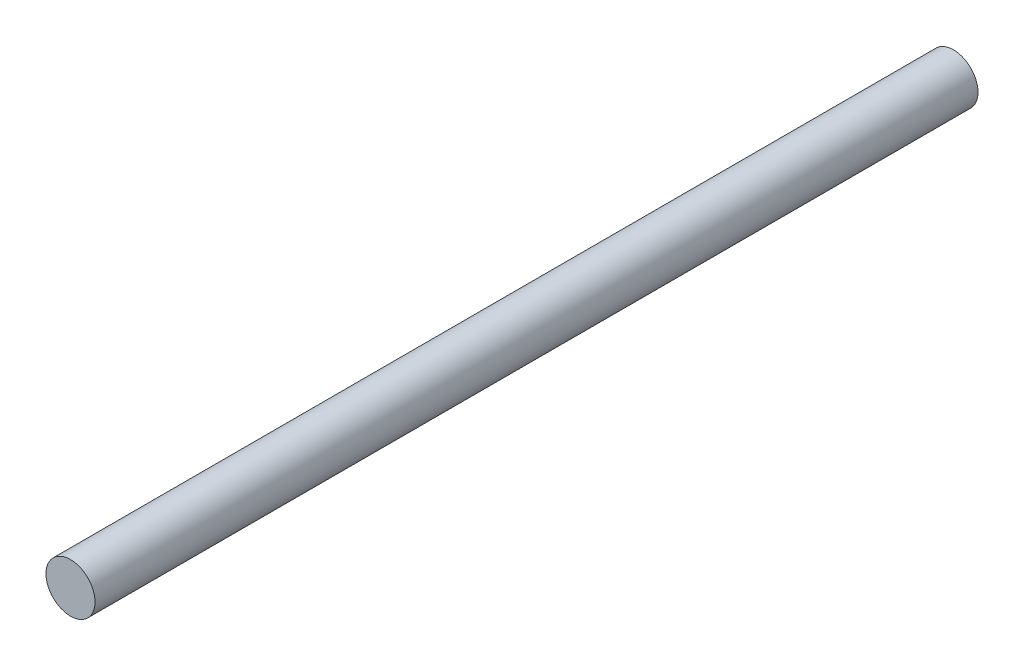
ISO-10303-21;
HEADER;
FILE_DESCRIPTION(('STEP AP214'),'2;1');
FILE_NAME('part.step','',(''),(''),'','','');
FILE_SCHEMA(('AUTOMOTIVE_DESIGN { 1 0 10303 214 1 1 1 1 }'));
ENDSEC;
DATA;
#1=APPLICATION_CONTEXT('core data for automotive mechanical design processes');
#2=APPLICATION_PROTOCOL_DEFINITION('international standard','automotive_design',2000,#1);
#3=PRODUCT_CONTEXT('',#1,'mechanical');
#4=PRODUCT('Part','Part','',(#3));
#5=PRODUCT_RELATED_PRODUCT_CATEGORY('part','',(#4));
#6=PRODUCT_DEFINITION_FORMATION('','',#4);
#7=PRODUCT_DEFINITION_CONTEXT('part definition',#1,'design');
#8=PRODUCT_DEFINITION('design','',#6,#7);
#9=PRODUCT_DEFINITION_SHAPE('','',#8);
#10=(LENGTH_UNIT() NAMED_UNIT(*) SI_UNIT(.MILLI.,.METRE.));
#11=(NAMED_UNIT(*) PLANE_ANGLE_UNIT() SI_UNIT($,.RADIAN.));
#12=(NAMED_UNIT(*) SI_UNIT($,.STERADIAN.) SOLID_ANGLE_UNIT());
#13=UNCERTAINTY_MEASURE_WITH_UNIT(LENGTH_MEASURE(1.E-05),#10,'distance_accuracy_value','');
#14=(GEOMETRIC_REPRESENTATION_CONTEXT(3) GLOBAL_UNCERTAINTY_ASSIGNED_CONTEXT((#13)) GLOBAL_UNIT_ASSIGNED_CONTEXT((#10,
#11,#12)) REPRESENTATION_CONTEXT('',''));
#15=CARTESIAN_POINT('',(0.,0.,0.));
#16=DIRECTION('',(0.,0.,1.));
#17=DIRECTION('',(1.,0.,0.));
#18=AXIS2_PLACEMENT_3D('',#15,#16,#17);
#19=CARTESIAN_POINT('',(0.,0.,-90.));
#20=DIRECTION('',(0.,0.,1.));
#21=DIRECTION('',(1.,0.,0.));
#22=AXIS2_PLACEMENT_3D('',#19,#20,#21);
#23=CYLINDRICAL_SURFACE('',#22,2.5);
#24=CARTESIAN_POINT('',(0.,0.,-90.));
#25=DIRECTION('',(0.,0.,1.));
#26=DIRECTION('',(1.,0.,0.));
#27=AXIS2_PLACEMENT_3D('',#24,#25,#26);
#28=CIRCLE('',#27,2.5);
#29=CARTESIAN_POINT('',(2.5,0.,-90.));
#30=VERTEX_POINT('',#29);
#31=EDGE_CURVE('E10',#30,#30,#28,.T.);
#32=CARTESIAN_POINT('',(0.,0.,0.));
#33=DIRECTION('',(0.,0.,1.));
#34=DIRECTION('',(1.,0.,0.));
#35=AXIS2_PLACEMENT_3D('',#32,#33,#34);
#36=CIRCLE('',#35,2.5);
#37=CARTESIAN_POINT('',(2.5,0.,0.));
#38=VERTEX_POINT('',#37);
#39=EDGE_CURVE('E44',#38,#38,#36,.T.);
#40=CARTESIAN_POINT('',(2.5,0.,-90.));
#41=CARTESIAN_POINT('',(2.5,0.,-89.0625));
#42=CARTESIAN_POINT('',(2.5,0.,-88.125));
#43=CARTESIAN_POINT('',(2.5,0.,-86.25));
#44=CARTESIAN_POINT('',(2.5,0.,-85.3125));
#45=CARTESIAN_POINT('',(2.5,0.,-83.4375));
#46=CARTESIAN_POINT('',(2.5,0.,-82.5));
#47=CARTESIAN_POINT('',(2.5,0.,-80.625));
#48=CARTESIAN_POINT('',(2.5,0.,-79.6875));
#49=CARTESIAN_POINT('',(2.5,0.,-77.8125));
#50=CARTESIAN_POINT('',(2.5,0.,-76.875));
#51=CARTESIAN_POINT('',(2.5,0.,-75.));
#52=CARTESIAN_POINT('',(2.5,0.,-74.0625));
#53=CARTESIAN_POINT('',(2.5,0.,-72.1875));
#54=CARTESIAN_POINT('',(2.5,0.,-71.25));
#55=CARTESIAN_POINT('',(2.5,0.,-69.375));
#56=CARTESIAN_POINT('',(2.5,0.,-68.4375));
#57=CARTESIAN_POINT('',(2.5,0.,-66.5625));
#58=CARTESIAN_POINT('',(2.5,0.,-65.625));
#59=CARTESIAN_POINT('',(2.5,0.,-63.75));
#60=CARTESIAN_POINT('',(2.5,0.,-62.8125));
#61=CARTESIAN_POINT('',(2.5,0.,-60.9375));
#62=CARTESIAN_POINT('',(2.5,0.,-60.));
#63=CARTESIAN_POINT('',(2.5,0.,-58.125));
#64=CARTESIAN_POINT('',(2.5,0.,-57.1875));
#65=CARTESIAN_POINT('',(2.5,0.,-55.3125));
#66=CARTESIAN_POINT('',(2.5,0.,-54.375));
#67=CARTESIAN_POINT('',(2.5,0.,-52.5));
#68=CARTESIAN_POINT('',(2.5,0.,-51.5625));
#69=CARTESIAN_POINT('',(2.5,0.,-49.6875));
#70=CARTESIAN_POINT('',(2.5,0.,-48.75));
#71=CARTESIAN_POINT('',(2.5,0.,-46.875));
#72=CARTESIAN_POINT('',(2.5,0.,-45.9375));
#73=CARTESIAN_POINT('',(2.5,0.,-44.0625));
#74=CARTESIAN_POINT('',(2.5,0.,-43.125));
#75=CARTESIAN_POINT('',(2.5,0.,-41.25));
#76=CARTESIAN_POINT('',(2.5,0.,-40.3125));
#77=CARTESIAN_POINT('',(2.5,0.,-38.4375));
#78=CARTESIAN_POINT('',(2.5,0.,-37.5));
#79=CARTESIAN_POINT('',(2.5,0.,-35.625));
#80=CARTESIAN_POINT('',(2.5,0.,-34.6875));
#81=CARTESIAN_POINT('',(2.5,0.,-32.8125));
#82=CARTESIAN_POINT('',(2.5,0.,-31.875));
#83=CARTESIAN_POINT('',(2.5,0.,-30.));
#84=CARTESIAN_POINT('',(2.5,0.,-29.0625));
#85=CARTESIAN_POINT('',(2.5,0.,-27.1875));
#86=CARTESIAN_POINT('',(2.5,0.,-26.25));
#87=CARTESIAN_POINT('',(2.5,0.,-24.375));
#88=CARTESIAN_POINT('',(2.5,0.,-23.4375));
#89=CARTESIAN_POINT('',(2.5,0.,-21.5625));
#90=CARTESIAN_POINT('',(2.5,0.,-20.625));
#91=CARTESIAN_POINT('',(2.5,0.,-18.75));
#92=CARTESIAN_POINT('',(2.5,0.,-17.8125));
#93=CARTESIAN_POINT('',(2.5,0.,-15.9375));
#94=CARTESIAN_POINT('',(2.5,0.,-15.));
#95=CARTESIAN_POINT('',(2.5,0.,-13.125));
#96=CARTESIAN_POINT('',(2.5,0.,-12.1875));
#97=CARTESIAN_POINT('',(2.5,0.,-10.3125));
#98=CARTESIAN_POINT('',(2.5,0.,-9.37500000000001));
#99=CARTESIAN_POINT('',(2.5,0.,-7.50000000000002));
#100=CARTESIAN_POINT('',(2.5,0.,-6.56250000000002));
#101=CARTESIAN_POINT('',(2.5,0.,-4.68750000000002));
#102=CARTESIAN_POINT('',(2.5,0.,-3.75000000000001));
#103=CARTESIAN_POINT('',(2.5,0.,-1.87500000000001));
#104=CARTESIAN_POINT('',(2.5,0.,-0.937500000000014));
#105=CARTESIAN_POINT('',(2.5,0.,0.));
#106=B_SPLINE_CURVE_WITH_KNOTS('',3,(#40,#41,#42,#43,#44,#45,#46,#47,#48,#49,#50,#51,#52,#53,
#54,#55,#56,#57,#58,#59,#60,#61,#62,#63,#64,#65,#66,#67,#68,#69,#70,#71,#72,#73,#74,#75,#76,#77,
#78,#79,#80,#81,#82,#83,#84,#85,#86,#87,#88,#89,#90,#91,#92,#93,#94,#95,#96,#97,#98,#99,#100,
#101,#102,#103,#104,#105),.UNSPECIFIED.,.F.,.F.,(4,2,2,2,2,2,2,2,2,2,2,2,2,2,2,2,2,2,2,2,2,2,2,
2,2,2,2,2,2,2,2,2,4),(0.,2.8125,5.62499999999999,8.43749999999999,11.25,14.0625,16.875,19.6875,
22.5,25.3125,28.125,30.9375,33.75,36.5625,39.375,42.1875,45.,47.8125,50.625,53.4375,56.25,
59.0625,61.875,64.6875,67.5,70.3125,73.125,75.9375,78.75,81.5625,84.375,87.1875,90.),.UNSPECIFIED.);
#107=EDGE_CURVE('BSEAM41',#30,#38,#106,.T.);
#108=ORIENTED_EDGE('',*,*,#31,.T.);
#109=ORIENTED_EDGE('',*,*,#39,.F.);
#110=ORIENTED_EDGE('',*,*,#107,.T.);
#111=ORIENTED_EDGE('',*,*,#107,.F.);
#112=EDGE_LOOP('',(#108,#110,#109,#111));
#113=FACE_BOUND('',#112,.T.);
#114=ADVANCED_FACE('F41',(#113),#23,.T.);
#115=CARTESIAN_POINT('',(0.,0.,-90.));
#116=DIRECTION('',(0.,0.,1.));
#117=DIRECTION('',(1.,0.,0.));
#118=AXIS2_PLACEMENT_3D('',#115,#116,#117);
#119=PLANE('',#118);
#120=ORIENTED_EDGE('',*,*,#31,.F.);
#121=EDGE_LOOP('',(#120));
#122=FACE_BOUND('',#121,.T.);
#123=ADVANCED_FACE('F58',(#122),#119,.F.);
#124=CARTESIAN_POINT('',(0.,0.,0.));
#125=DIRECTION('',(0.,0.,1.));
#126=DIRECTION('',(1.,0.,0.));
#127=AXIS2_PLACEMENT_3D('',#124,#125,#126);
#128=PLANE('',#127);
#129=ORIENTED_EDGE('',*,*,#39,.T.);
#130=EDGE_LOOP('',(#129));
#131=FACE_BOUND('',#130,.T.);
#132=ADVANCED_FACE('F55',(#131),#128,.T.);
#133=CLOSED_SHELL('',(#114,#123,#132));
#134=MANIFOLD_SOLID_BREP('B2',#133);
#135=ADVANCED_BREP_SHAPE_REPRESENTATION('',(#18,#134),#14);
#136=SHAPE_DEFINITION_REPRESENTATION(#9,#135);
ENDSEC;
END-ISO-10303-21;
